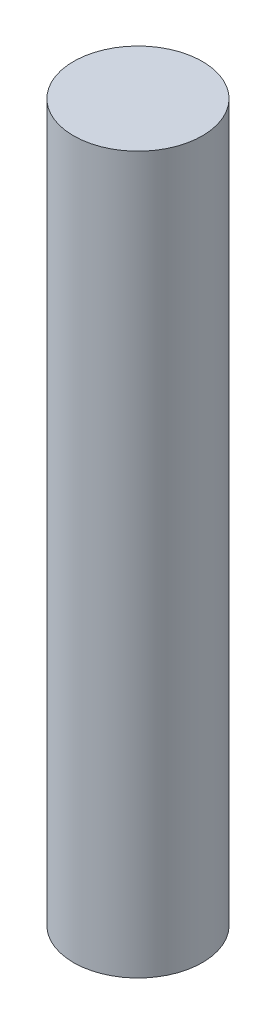
ISO-10303-21;
HEADER;
FILE_DESCRIPTION(('STEP AP214'),'2;1');
FILE_NAME('part.step','',(''),(''),'','','');
FILE_SCHEMA(('AUTOMOTIVE_DESIGN { 1 0 10303 214 1 1 1 1 }'));
ENDSEC;
DATA;
#1=APPLICATION_CONTEXT('core data for automotive mechanical design processes');
#2=APPLICATION_PROTOCOL_DEFINITION('international standard','automotive_design',2000,#1);
#3=PRODUCT_CONTEXT('',#1,'mechanical');
#4=PRODUCT('Part','Part','',(#3));
#5=PRODUCT_RELATED_PRODUCT_CATEGORY('part','',(#4));
#6=PRODUCT_DEFINITION_FORMATION('','',#4);
#7=PRODUCT_DEFINITION_CONTEXT('part definition',#1,'design');
#8=PRODUCT_DEFINITION('design','',#6,#7);
#9=PRODUCT_DEFINITION_SHAPE('','',#8);
#10=(LENGTH_UNIT() NAMED_UNIT(*) SI_UNIT(.MILLI.,.METRE.));
#11=(NAMED_UNIT(*) PLANE_ANGLE_UNIT() SI_UNIT($,.RADIAN.));
#12=(NAMED_UNIT(*) SI_UNIT($,.STERADIAN.) SOLID_ANGLE_UNIT());
#13=UNCERTAINTY_MEASURE_WITH_UNIT(LENGTH_MEASURE(1.E-05),#10,'distance_accuracy_value','');
#14=(GEOMETRIC_REPRESENTATION_CONTEXT(3) GLOBAL_UNCERTAINTY_ASSIGNED_CONTEXT((#13)) GLOBAL_UNIT_ASSIGNED_CONTEXT((#10,
#11,#12)) REPRESENTATION_CONTEXT('',''));
#15=CARTESIAN_POINT('',(0.,0.,0.));
#16=DIRECTION('',(0.,0.,1.));
#17=DIRECTION('',(1.,0.,0.));
#18=AXIS2_PLACEMENT_3D('',#15,#16,#17);
#19=CARTESIAN_POINT('',(0.,100.,0.));
#20=DIRECTION('',(0.,-1.,0.));
#21=DIRECTION('',(0.,0.,-1.));
#22=AXIS2_PLACEMENT_3D('',#19,#20,#21);
#23=CYLINDRICAL_SURFACE('',#22,9.);
#24=CARTESIAN_POINT('',(0.,100.,0.));
#25=DIRECTION('',(0.,1.,0.));
#26=DIRECTION('',(0.,0.,1.));
#27=AXIS2_PLACEMENT_3D('',#24,#25,#26);
#28=CIRCLE('',#27,9.);
#29=CARTESIAN_POINT('',(0.,100.,9.));
#30=VERTEX_POINT('',#29);
#31=EDGE_CURVE('E10',#30,#30,#28,.T.);
#32=ORIENTED_EDGE('',*,*,#31,.F.);
#33=EDGE_LOOP('',(#32));
#34=FACE_BOUND('',#33,.T.);
#35=CARTESIAN_POINT('',(0.,0.,0.));
#36=DIRECTION('',(0.,1.,0.));
#37=DIRECTION('',(0.,0.,1.));
#38=AXIS2_PLACEMENT_3D('',#35,#36,#37);
#39=CIRCLE('',#38,9.);
#40=CARTESIAN_POINT('',(0.,0.,9.));
#41=VERTEX_POINT('',#40);
#42=EDGE_CURVE('E46',#41,#41,#39,.T.);
#43=ORIENTED_EDGE('',*,*,#42,.T.);
#44=EDGE_LOOP('',(#43));
#45=FACE_BOUND('',#44,.T.);
#46=ADVANCED_FACE('F43',(#34,#45),#23,.T.);
#47=CARTESIAN_POINT('',(0.,100.,0.));
#48=DIRECTION('',(0.,1.,0.));
#49=DIRECTION('',(0.,0.,1.));
#50=AXIS2_PLACEMENT_3D('',#47,#48,#49);
#51=PLANE('',#50);
#52=ORIENTED_EDGE('',*,*,#31,.T.);
#53=EDGE_LOOP('',(#52));
#54=FACE_BOUND('',#53,.T.);
#55=ADVANCED_FACE('F60',(#54),#51,.T.);
#56=CARTESIAN_POINT('',(0.,0.,0.));
#57=DIRECTION('',(0.,1.,0.));
#58=DIRECTION('',(0.,0.,1.));
#59=AXIS2_PLACEMENT_3D('',#56,#57,#58);
#60=PLANE('',#59);
#61=ORIENTED_EDGE('',*,*,#42,.F.);
#62=EDGE_LOOP('',(#61));
#63=FACE_BOUND('',#62,.T.);
#64=ADVANCED_FACE('F58',(#63),#60,.F.);
#65=CLOSED_SHELL('',(#46,#55,#64));
#66=MANIFOLD_SOLID_BREP('B2',#65);
#67=ADVANCED_BREP_SHAPE_REPRESENTATION('',(#18,#66),#14);
#68=SHAPE_DEFINITION_REPRESENTATION(#9,#67);
ENDSEC;
END-ISO-10303-21;
